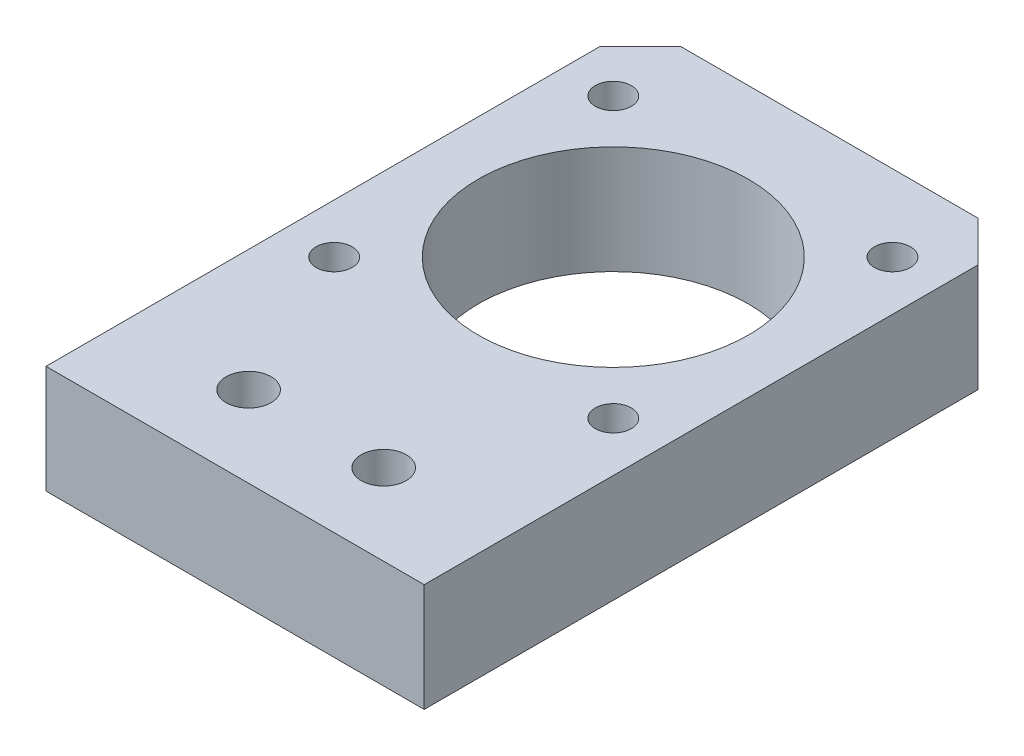
ISO-10303-21;
HEADER;
FILE_DESCRIPTION(('STEP AP214'),'2;1');
FILE_NAME('part.step','',(''),(''),'','','');
FILE_SCHEMA(('AUTOMOTIVE_DESIGN { 1 0 10303 214 1 1 1 1 }'));
ENDSEC;
DATA;
#1=APPLICATION_CONTEXT('core data for automotive mechanical design processes');
#2=APPLICATION_PROTOCOL_DEFINITION('international standard','automotive_design',2000,#1);
#3=PRODUCT_CONTEXT('',#1,'mechanical');
#4=PRODUCT('Part','Part','',(#3));
#5=PRODUCT_RELATED_PRODUCT_CATEGORY('part','',(#4));
#6=PRODUCT_DEFINITION_FORMATION('','',#4);
#7=PRODUCT_DEFINITION_CONTEXT('part definition',#1,'design');
#8=PRODUCT_DEFINITION('design','',#6,#7);
#9=PRODUCT_DEFINITION_SHAPE('','',#8);
#10=(LENGTH_UNIT() NAMED_UNIT(*) SI_UNIT(.MILLI.,.METRE.));
#11=(NAMED_UNIT(*) PLANE_ANGLE_UNIT() SI_UNIT($,.RADIAN.));
#12=(NAMED_UNIT(*) SI_UNIT($,.STERADIAN.) SOLID_ANGLE_UNIT());
#13=UNCERTAINTY_MEASURE_WITH_UNIT(LENGTH_MEASURE(1.E-05),#10,'distance_accuracy_value','');
#14=(GEOMETRIC_REPRESENTATION_CONTEXT(3) GLOBAL_UNCERTAINTY_ASSIGNED_CONTEXT((#13)) GLOBAL_UNIT_ASSIGNED_CONTEXT((#10,
#11,#12)) REPRESENTATION_CONTEXT('',''));
#15=CARTESIAN_POINT('',(0.,0.,0.));
#16=DIRECTION('',(0.,0.,1.));
#17=DIRECTION('',(1.,0.,0.));
#18=AXIS2_PLACEMENT_3D('',#15,#16,#17);
#19=CARTESIAN_POINT('',(-85.9777324242625,12.,-19.4021185238704));
#20=DIRECTION('',(0.,0.,-1.));
#21=DIRECTION('',(-1.,0.,0.));
#22=AXIS2_PLACEMENT_3D('',#19,#20,#21);
#23=PLANE('',#22);
#24=DIRECTION('',(1.,0.,0.));
#25=VECTOR('',#24,1.);
#26=CARTESIAN_POINT('',(-85.9777324242625,0.,-19.4021185238704));
#27=LINE('',#26,#25);
#28=CARTESIAN_POINT('',(-16.9777324242625,0.,-19.4021185238704));
#29=VERTEX_POINT('',#28);
#30=CARTESIAN_POINT('',(25.0222675757375,0.,-19.4021185238704));
#31=VERTEX_POINT('',#30);
#32=EDGE_CURVE('E104',#29,#31,#27,.T.);
#33=ORIENTED_EDGE('',*,*,#32,.T.);
#34=DIRECTION('',(0.,-1.,0.));
#35=VECTOR('',#34,1.);
#36=CARTESIAN_POINT('',(25.0222675757375,12.,-19.4021185238704));
#37=LINE('',#36,#35);
#38=CARTESIAN_POINT('',(25.0222675757375,12.,-19.4021185238704));
#39=VERTEX_POINT('',#38);
#40=EDGE_CURVE('E90',#39,#31,#37,.T.);
#41=ORIENTED_EDGE('',*,*,#40,.F.);
#42=DIRECTION('',(1.,0.,0.));
#43=VECTOR('',#42,1.);
#44=CARTESIAN_POINT('',(-85.9777324242625,12.,-19.4021185238704));
#45=LINE('',#44,#43);
#46=CARTESIAN_POINT('',(-16.9777324242625,12.,-19.4021185238704));
#47=VERTEX_POINT('',#46);
#48=EDGE_CURVE('E102',#47,#39,#45,.T.);
#49=ORIENTED_EDGE('',*,*,#48,.F.);
#50=DIRECTION('',(0.,-1.,0.));
#51=VECTOR('',#50,1.);
#52=CARTESIAN_POINT('',(-16.9777324242625,12.,-19.4021185238704));
#53=LINE('',#52,#51);
#54=EDGE_CURVE('E105',#47,#29,#53,.T.);
#55=ORIENTED_EDGE('',*,*,#54,.T.);
#56=EDGE_LOOP('',(#33,#41,#49,#55));
#57=FACE_BOUND('',#56,.T.);
#58=ADVANCED_FACE('F34',(#57),#23,.F.);
#59=CARTESIAN_POINT('',(0.,12.,0.));
#60=DIRECTION('',(0.,-1.,0.));
#61=DIRECTION('',(0.,0.,-1.));
#62=AXIS2_PLACEMENT_3D('',#59,#60,#61);
#63=PLANE('',#62);
#64=CARTESIAN_POINT('',(-11.4777324242625,12.,-76.9021185238704));
#65=DIRECTION('',(0.,-1.,0.));
#66=DIRECTION('',(0.,0.,-1.));
#67=AXIS2_PLACEMENT_3D('',#64,#65,#66);
#68=CIRCLE('',#67,2.);
#69=CARTESIAN_POINT('',(-11.4777324242625,12.,-78.9021185238704));
#70=VERTEX_POINT('',#69);
#71=EDGE_CURVE('E336',#70,#70,#68,.T.);
#72=ORIENTED_EDGE('',*,*,#71,.T.);
#73=EDGE_LOOP('',(#72));
#74=FACE_BOUND('',#73,.T.);
#75=CARTESIAN_POINT('',(-11.4777324242625,12.,-45.9021185238704));
#76=DIRECTION('',(0.,-1.,0.));
#77=DIRECTION('',(0.,0.,-1.));
#78=AXIS2_PLACEMENT_3D('',#75,#76,#77);
#79=CIRCLE('',#78,2.);
#80=CARTESIAN_POINT('',(-11.4777324242625,12.,-47.9021185238704));
#81=VERTEX_POINT('',#80);
#82=EDGE_CURVE('E357',#81,#81,#79,.T.);
#83=ORIENTED_EDGE('',*,*,#82,.T.);
#84=EDGE_LOOP('',(#83));
#85=FACE_BOUND('',#84,.T.);
#86=CARTESIAN_POINT('',(19.5222675757375,12.,-45.9021185238704));
#87=DIRECTION('',(0.,-1.,0.));
#88=DIRECTION('',(0.,0.,-1.));
#89=AXIS2_PLACEMENT_3D('',#86,#87,#88);
#90=CIRCLE('',#89,2.00000000000001);
#91=CARTESIAN_POINT('',(19.5222675757375,12.,-47.9021185238704));
#92=VERTEX_POINT('',#91);
#93=EDGE_CURVE('E351',#92,#92,#90,.T.);
#94=ORIENTED_EDGE('',*,*,#93,.T.);
#95=EDGE_LOOP('',(#94));
#96=FACE_BOUND('',#95,.T.);
#97=CARTESIAN_POINT('',(19.5222675757375,12.,-76.9021185238704));
#98=DIRECTION('',(0.,-1.,0.));
#99=DIRECTION('',(0.,0.,-1.));
#100=AXIS2_PLACEMENT_3D('',#97,#98,#99);
#101=CIRCLE('',#100,2.00000000000001);
#102=CARTESIAN_POINT('',(19.5222675757375,12.,-78.9021185238704));
#103=VERTEX_POINT('',#102);
#104=EDGE_CURVE('E345',#103,#103,#101,.T.);
#105=ORIENTED_EDGE('',*,*,#104,.T.);
#106=EDGE_LOOP('',(#105));
#107=FACE_BOUND('',#106,.T.);
#108=CARTESIAN_POINT('',(4.02226757573749,12.,-61.4021185238704));
#109=DIRECTION('',(0.,-1.,0.));
#110=DIRECTION('',(0.,0.,-1.));
#111=AXIS2_PLACEMENT_3D('',#108,#109,#110);
#112=CIRCLE('',#111,15.);
#113=CARTESIAN_POINT('',(4.02226757573749,12.,-76.4021185238704));
#114=VERTEX_POINT('',#113);
#115=EDGE_CURVE('E140',#114,#114,#112,.T.);
#116=ORIENTED_EDGE('',*,*,#115,.T.);
#117=EDGE_LOOP('',(#116));
#118=FACE_BOUND('',#117,.T.);
#119=CARTESIAN_POINT('',(-3.47773242426255,12.,-28.4021185238704));
#120=DIRECTION('',(0.,1.,0.));
#121=DIRECTION('',(0.,0.,1.));
#122=AXIS2_PLACEMENT_3D('',#119,#120,#121);
#123=CIRCLE('',#122,2.5);
#124=CARTESIAN_POINT('',(-3.47773242426255,12.,-25.9021185238704));
#125=VERTEX_POINT('',#124);
#126=EDGE_CURVE('E152',#125,#125,#123,.T.);
#127=ORIENTED_EDGE('',*,*,#126,.F.);
#128=EDGE_LOOP('',(#127));
#129=FACE_BOUND('',#128,.T.);
#130=CARTESIAN_POINT('',(11.5222675757375,12.,-28.4021185238704));
#131=DIRECTION('',(0.,1.,0.));
#132=DIRECTION('',(0.,0.,1.));
#133=AXIS2_PLACEMENT_3D('',#130,#131,#132);
#134=CIRCLE('',#133,2.5);
#135=CARTESIAN_POINT('',(11.5222675757375,12.,-25.9021185238704));
#136=VERTEX_POINT('',#135);
#137=EDGE_CURVE('E117',#136,#136,#134,.T.);
#138=ORIENTED_EDGE('',*,*,#137,.F.);
#139=EDGE_LOOP('',(#138));
#140=FACE_BOUND('',#139,.T.);
#141=ORIENTED_EDGE('',*,*,#48,.T.);
#142=DIRECTION('',(0.,0.,1.));
#143=VECTOR('',#142,1.);
#144=CARTESIAN_POINT('',(25.0222675757375,12.,-85.4021185238704));
#145=LINE('',#144,#143);
#146=CARTESIAN_POINT('',(25.0222675757375,12.,-80.9021185238704));
#147=VERTEX_POINT('',#146);
#148=EDGE_CURVE('E87',#147,#39,#145,.T.);
#149=ORIENTED_EDGE('',*,*,#148,.F.);
#150=DIRECTION('',(0.707106781186545,0.,0.70710678118655));
#151=VECTOR('',#150,1.);
#152=CARTESIAN_POINT('',(20.5222675757375,12.,-85.4021185238704));
#153=LINE('',#152,#151);
#154=CARTESIAN_POINT('',(20.5222675757375,12.,-85.4021185238704));
#155=VERTEX_POINT('',#154);
#156=EDGE_CURVE('E122',#147,#155,#153,.F.);
#157=ORIENTED_EDGE('',*,*,#156,.T.);
#158=DIRECTION('',(1.,0.,0.));
#159=VECTOR('',#158,1.);
#160=CARTESIAN_POINT('',(25.0222675757375,12.,-85.4021185238704));
#161=LINE('',#160,#159);
#162=CARTESIAN_POINT('',(-12.4777324242625,12.,-85.4021185238704));
#163=VERTEX_POINT('',#162);
#164=EDGE_CURVE('E97',#163,#155,#161,.T.);
#165=ORIENTED_EDGE('',*,*,#164,.F.);
#166=DIRECTION('',(0.707106781186545,0.,-0.70710678118655));
#167=VECTOR('',#166,1.);
#168=CARTESIAN_POINT('',(-12.4777324242625,12.,-85.4021185238704));
#169=LINE('',#168,#167);
#170=CARTESIAN_POINT('',(-16.9777324242625,12.,-80.9021185238704));
#171=VERTEX_POINT('',#170);
#172=EDGE_CURVE('E124',#163,#171,#169,.F.);
#173=ORIENTED_EDGE('',*,*,#172,.T.);
#174=DIRECTION('',(0.,0.,1.));
#175=VECTOR('',#174,1.);
#176=CARTESIAN_POINT('',(-16.9777324242625,12.,-85.4021185238704));
#177=LINE('',#176,#175);
#178=EDGE_CURVE('E96',#171,#47,#177,.T.);
#179=ORIENTED_EDGE('',*,*,#178,.T.);
#180=EDGE_LOOP('',(#141,#149,#157,#165,#173,#179));
#181=FACE_BOUND('',#180,.T.);
#182=ADVANCED_FACE('F107',(#74,#85,#96,#107,#118,#129,#140,#181),#63,.F.);
#183=CARTESIAN_POINT('',(0.,0.,0.));
#184=DIRECTION('',(0.,-1.,0.));
#185=DIRECTION('',(0.,0.,-1.));
#186=AXIS2_PLACEMENT_3D('',#183,#184,#185);
#187=PLANE('',#186);
#188=DIRECTION('',(0.,0.,1.));
#189=VECTOR('',#188,1.);
#190=CARTESIAN_POINT('',(25.0222675757375,0.,-85.4021185238704));
#191=LINE('',#190,#189);
#192=CARTESIAN_POINT('',(25.0222675757375,0.,-80.9021185238704));
#193=VERTEX_POINT('',#192);
#194=EDGE_CURVE('E145',#193,#31,#191,.T.);
#195=ORIENTED_EDGE('',*,*,#194,.T.);
#196=ORIENTED_EDGE('',*,*,#32,.F.);
#197=DIRECTION('',(0.,0.,1.));
#198=VECTOR('',#197,1.);
#199=CARTESIAN_POINT('',(-16.9777324242625,0.,-85.4021185238704));
#200=LINE('',#199,#198);
#201=CARTESIAN_POINT('',(-16.9777324242625,0.,-80.9021185238704));
#202=VERTEX_POINT('',#201);
#203=EDGE_CURVE('E132',#202,#29,#200,.T.);
#204=ORIENTED_EDGE('',*,*,#203,.F.);
#205=DIRECTION('',(-0.707106781186545,0.,0.70710678118655));
#206=VECTOR('',#205,1.);
#207=CARTESIAN_POINT('',(-48.9399254740665,0.,-48.9399254740662));
#208=LINE('',#207,#206);
#209=CARTESIAN_POINT('',(-12.4777324242625,0.,-85.4021185238704));
#210=VERTEX_POINT('',#209);
#211=EDGE_CURVE('E42',#202,#210,#208,.F.);
#212=ORIENTED_EDGE('',*,*,#211,.T.);
#213=DIRECTION('',(-1.,0.,0.));
#214=VECTOR('',#213,1.);
#215=CARTESIAN_POINT('',(25.0222675757375,0.,-85.4021185238704));
#216=LINE('',#215,#214);
#217=CARTESIAN_POINT('',(20.5222675757375,0.,-85.4021185238704));
#218=VERTEX_POINT('',#217);
#219=EDGE_CURVE('E131',#218,#210,#216,.T.);
#220=ORIENTED_EDGE('',*,*,#219,.F.);
#221=DIRECTION('',(-0.707106781186545,0.,-0.70710678118655));
#222=VECTOR('',#221,1.);
#223=CARTESIAN_POINT('',(52.962193049804,0.,-52.9621930498036));
#224=LINE('',#223,#222);
#225=EDGE_CURVE('E49',#218,#193,#224,.F.);
#226=ORIENTED_EDGE('',*,*,#225,.T.);
#227=EDGE_LOOP('',(#195,#196,#204,#212,#220,#226));
#228=FACE_BOUND('',#227,.T.);
#229=CARTESIAN_POINT('',(-11.4777324242625,0.,-76.9021185238704));
#230=DIRECTION('',(0.,-1.,0.));
#231=DIRECTION('',(0.,0.,-1.));
#232=AXIS2_PLACEMENT_3D('',#229,#230,#231);
#233=CIRCLE('',#232,2.);
#234=CARTESIAN_POINT('',(-11.4777324242625,0.,-78.9021185238704));
#235=VERTEX_POINT('',#234);
#236=EDGE_CURVE('E339',#235,#235,#233,.T.);
#237=ORIENTED_EDGE('',*,*,#236,.F.);
#238=EDGE_LOOP('',(#237));
#239=FACE_BOUND('',#238,.T.);
#240=CARTESIAN_POINT('',(-11.4777324242625,0.,-45.9021185238704));
#241=DIRECTION('',(0.,-1.,0.));
#242=DIRECTION('',(0.,0.,-1.));
#243=AXIS2_PLACEMENT_3D('',#240,#241,#242);
#244=CIRCLE('',#243,2.);
#245=CARTESIAN_POINT('',(-11.4777324242625,0.,-47.9021185238704));
#246=VERTEX_POINT('',#245);
#247=EDGE_CURVE('E354',#246,#246,#244,.T.);
#248=ORIENTED_EDGE('',*,*,#247,.F.);
#249=EDGE_LOOP('',(#248));
#250=FACE_BOUND('',#249,.T.);
#251=CARTESIAN_POINT('',(19.5222675757375,0.,-45.9021185238704));
#252=DIRECTION('',(0.,-1.,0.));
#253=DIRECTION('',(0.,0.,-1.));
#254=AXIS2_PLACEMENT_3D('',#251,#252,#253);
#255=CIRCLE('',#254,2.00000000000001);
#256=CARTESIAN_POINT('',(19.5222675757375,0.,-47.9021185238704));
#257=VERTEX_POINT('',#256);
#258=EDGE_CURVE('E348',#257,#257,#255,.T.);
#259=ORIENTED_EDGE('',*,*,#258,.F.);
#260=EDGE_LOOP('',(#259));
#261=FACE_BOUND('',#260,.T.);
#262=CARTESIAN_POINT('',(19.5222675757375,0.,-76.9021185238704));
#263=DIRECTION('',(0.,-1.,0.));
#264=DIRECTION('',(0.,0.,-1.));
#265=AXIS2_PLACEMENT_3D('',#262,#263,#264);
#266=CIRCLE('',#265,2.00000000000001);
#267=CARTESIAN_POINT('',(19.5222675757375,0.,-78.9021185238704));
#268=VERTEX_POINT('',#267);
#269=EDGE_CURVE('E342',#268,#268,#266,.T.);
#270=ORIENTED_EDGE('',*,*,#269,.F.);
#271=EDGE_LOOP('',(#270));
#272=FACE_BOUND('',#271,.T.);
#273=CARTESIAN_POINT('',(4.02226757573749,0.,-61.4021185238704));
#274=DIRECTION('',(0.,-1.,0.));
#275=DIRECTION('',(0.,0.,-1.));
#276=AXIS2_PLACEMENT_3D('',#273,#274,#275);
#277=CIRCLE('',#276,15.);
#278=CARTESIAN_POINT('',(4.02226757573749,0.,-76.4021185238704));
#279=VERTEX_POINT('',#278);
#280=EDGE_CURVE('E334',#279,#279,#277,.T.);
#281=ORIENTED_EDGE('',*,*,#280,.F.);
#282=EDGE_LOOP('',(#281));
#283=FACE_BOUND('',#282,.T.);
#284=CARTESIAN_POINT('',(-3.47773242426255,0.,-28.4021185238704));
#285=DIRECTION('',(0.,1.,0.));
#286=DIRECTION('',(0.,0.,1.));
#287=AXIS2_PLACEMENT_3D('',#284,#285,#286);
#288=CIRCLE('',#287,2.5);
#289=CARTESIAN_POINT('',(-3.47773242426255,0.,-25.9021185238704));
#290=VERTEX_POINT('',#289);
#291=EDGE_CURVE('E114',#290,#290,#288,.T.);
#292=ORIENTED_EDGE('',*,*,#291,.T.);
#293=EDGE_LOOP('',(#292));
#294=FACE_BOUND('',#293,.T.);
#295=CARTESIAN_POINT('',(11.5222675757375,0.,-28.4021185238704));
#296=DIRECTION('',(0.,1.,0.));
#297=DIRECTION('',(0.,0.,1.));
#298=AXIS2_PLACEMENT_3D('',#295,#296,#297);
#299=CIRCLE('',#298,2.5);
#300=CARTESIAN_POINT('',(11.5222675757375,0.,-25.9021185238704));
#301=VERTEX_POINT('',#300);
#302=EDGE_CURVE('E154',#301,#301,#299,.T.);
#303=ORIENTED_EDGE('',*,*,#302,.T.);
#304=EDGE_LOOP('',(#303));
#305=FACE_BOUND('',#304,.T.);
#306=ADVANCED_FACE('F129',(#228,#239,#250,#261,#272,#283,#294,#305),#187,.T.);
#307=CARTESIAN_POINT('',(11.5222675757375,0.,-28.4021185238704));
#308=DIRECTION('',(0.,1.,0.));
#309=DIRECTION('',(0.,0.,1.));
#310=AXIS2_PLACEMENT_3D('',#307,#308,#309);
#311=CYLINDRICAL_SURFACE('',#310,2.5);
#312=ORIENTED_EDGE('',*,*,#302,.F.);
#313=EDGE_LOOP('',(#312));
#314=FACE_BOUND('',#313,.T.);
#315=ORIENTED_EDGE('',*,*,#137,.T.);
#316=EDGE_LOOP('',(#315));
#317=FACE_BOUND('',#316,.T.);
#318=ADVANCED_FACE('F161',(#314,#317),#311,.F.);
#319=CARTESIAN_POINT('',(-3.47773242426255,0.,-28.4021185238704));
#320=DIRECTION('',(0.,1.,0.));
#321=DIRECTION('',(0.,0.,1.));
#322=AXIS2_PLACEMENT_3D('',#319,#320,#321);
#323=CYLINDRICAL_SURFACE('',#322,2.5);
#324=ORIENTED_EDGE('',*,*,#291,.F.);
#325=EDGE_LOOP('',(#324));
#326=FACE_BOUND('',#325,.T.);
#327=ORIENTED_EDGE('',*,*,#126,.T.);
#328=EDGE_LOOP('',(#327));
#329=FACE_BOUND('',#328,.T.);
#330=ADVANCED_FACE('F211',(#326,#329),#323,.F.);
#331=CARTESIAN_POINT('',(25.0222675757375,0.,-85.4021185238704));
#332=DIRECTION('',(-1.,0.,0.));
#333=DIRECTION('',(0.,-1.,0.));
#334=AXIS2_PLACEMENT_3D('',#331,#332,#333);
#335=PLANE('',#334);
#336=ORIENTED_EDGE('',*,*,#148,.T.);
#337=ORIENTED_EDGE('',*,*,#40,.T.);
#338=ORIENTED_EDGE('',*,*,#194,.F.);
#339=DIRECTION('',(0.,1.,0.));
#340=VECTOR('',#339,1.);
#341=CARTESIAN_POINT('',(25.0222675757375,0.,-80.9021185238704));
#342=LINE('',#341,#340);
#343=EDGE_CURVE('E11',#193,#147,#342,.T.);
#344=ORIENTED_EDGE('',*,*,#343,.T.);
#345=EDGE_LOOP('',(#336,#337,#338,#344));
#346=FACE_BOUND('',#345,.T.);
#347=ADVANCED_FACE('F89',(#346),#335,.F.);
#348=CARTESIAN_POINT('',(-16.9777324242625,0.,-85.4021185238704));
#349=DIRECTION('',(1.,0.,0.));
#350=DIRECTION('',(0.,1.,0.));
#351=AXIS2_PLACEMENT_3D('',#348,#349,#350);
#352=PLANE('',#351);
#353=ORIENTED_EDGE('',*,*,#203,.T.);
#354=ORIENTED_EDGE('',*,*,#54,.F.);
#355=ORIENTED_EDGE('',*,*,#178,.F.);
#356=DIRECTION('',(0.,-1.,0.));
#357=VECTOR('',#356,1.);
#358=CARTESIAN_POINT('',(-16.9777324242625,0.,-80.9021185238704));
#359=LINE('',#358,#357);
#360=EDGE_CURVE('E57',#171,#202,#359,.T.);
#361=ORIENTED_EDGE('',*,*,#360,.T.);
#362=EDGE_LOOP('',(#353,#354,#355,#361));
#363=FACE_BOUND('',#362,.T.);
#364=ADVANCED_FACE('F143',(#363),#352,.F.);
#365=CARTESIAN_POINT('',(0.,0.,-85.4021185238704));
#366=DIRECTION('',(0.,0.,1.));
#367=DIRECTION('',(1.,0.,0.));
#368=AXIS2_PLACEMENT_3D('',#365,#366,#367);
#369=PLANE('',#368);
#370=ORIENTED_EDGE('',*,*,#219,.T.);
#371=DIRECTION('',(0.,1.,0.));
#372=VECTOR('',#371,1.);
#373=CARTESIAN_POINT('',(-12.4777324242625,0.,-85.4021185238704));
#374=LINE('',#373,#372);
#375=EDGE_CURVE('E112',#210,#163,#374,.T.);
#376=ORIENTED_EDGE('',*,*,#375,.T.);
#377=ORIENTED_EDGE('',*,*,#164,.T.);
#378=DIRECTION('',(0.,-1.,0.));
#379=VECTOR('',#378,1.);
#380=CARTESIAN_POINT('',(20.5222675757375,0.,-85.4021185238704));
#381=LINE('',#380,#379);
#382=EDGE_CURVE('E109',#155,#218,#381,.T.);
#383=ORIENTED_EDGE('',*,*,#382,.T.);
#384=EDGE_LOOP('',(#370,#376,#377,#383));
#385=FACE_BOUND('',#384,.T.);
#386=ADVANCED_FACE('F136',(#385),#369,.F.);
#387=CARTESIAN_POINT('',(4.02226757573749,12.,-61.4021185238704));
#388=DIRECTION('',(0.,-1.,0.));
#389=DIRECTION('',(0.,0.,-1.));
#390=AXIS2_PLACEMENT_3D('',#387,#388,#389);
#391=CYLINDRICAL_SURFACE('',#390,15.);
#392=ORIENTED_EDGE('',*,*,#115,.F.);
#393=EDGE_LOOP('',(#392));
#394=FACE_BOUND('',#393,.T.);
#395=ORIENTED_EDGE('',*,*,#280,.T.);
#396=EDGE_LOOP('',(#395));
#397=FACE_BOUND('',#396,.T.);
#398=ADVANCED_FACE('F201',(#394,#397),#391,.F.);
#399=CARTESIAN_POINT('',(19.5222675757375,12.,-76.9021185238704));
#400=DIRECTION('',(0.,-1.,0.));
#401=DIRECTION('',(0.,0.,-1.));
#402=AXIS2_PLACEMENT_3D('',#399,#400,#401);
#403=CYLINDRICAL_SURFACE('',#402,2.00000000000001);
#404=ORIENTED_EDGE('',*,*,#104,.F.);
#405=EDGE_LOOP('',(#404));
#406=FACE_BOUND('',#405,.T.);
#407=ORIENTED_EDGE('',*,*,#269,.T.);
#408=EDGE_LOOP('',(#407));
#409=FACE_BOUND('',#408,.T.);
#410=ADVANCED_FACE('F197',(#406,#409),#403,.F.);
#411=CARTESIAN_POINT('',(19.5222675757375,12.,-45.9021185238704));
#412=DIRECTION('',(0.,-1.,0.));
#413=DIRECTION('',(0.,0.,-1.));
#414=AXIS2_PLACEMENT_3D('',#411,#412,#413);
#415=CYLINDRICAL_SURFACE('',#414,2.00000000000001);
#416=ORIENTED_EDGE('',*,*,#93,.F.);
#417=EDGE_LOOP('',(#416));
#418=FACE_BOUND('',#417,.T.);
#419=ORIENTED_EDGE('',*,*,#258,.T.);
#420=EDGE_LOOP('',(#419));
#421=FACE_BOUND('',#420,.T.);
#422=ADVANCED_FACE('F189',(#418,#421),#415,.F.);
#423=CARTESIAN_POINT('',(-11.4777324242625,12.,-45.9021185238704));
#424=DIRECTION('',(0.,-1.,0.));
#425=DIRECTION('',(0.,0.,-1.));
#426=AXIS2_PLACEMENT_3D('',#423,#424,#425);
#427=CYLINDRICAL_SURFACE('',#426,2.);
#428=ORIENTED_EDGE('',*,*,#82,.F.);
#429=EDGE_LOOP('',(#428));
#430=FACE_BOUND('',#429,.T.);
#431=ORIENTED_EDGE('',*,*,#247,.T.);
#432=EDGE_LOOP('',(#431));
#433=FACE_BOUND('',#432,.T.);
#434=ADVANCED_FACE('F183',(#430,#433),#427,.F.);
#435=CARTESIAN_POINT('',(-11.4777324242625,12.,-76.9021185238704));
#436=DIRECTION('',(0.,-1.,0.));
#437=DIRECTION('',(0.,0.,-1.));
#438=AXIS2_PLACEMENT_3D('',#435,#436,#437);
#439=CYLINDRICAL_SURFACE('',#438,2.);
#440=ORIENTED_EDGE('',*,*,#71,.F.);
#441=EDGE_LOOP('',(#440));
#442=FACE_BOUND('',#441,.T.);
#443=ORIENTED_EDGE('',*,*,#236,.T.);
#444=EDGE_LOOP('',(#443));
#445=FACE_BOUND('',#444,.T.);
#446=ADVANCED_FACE('F177',(#442,#445),#439,.F.);
#447=CARTESIAN_POINT('',(-12.4777324242625,0.,-85.4021185238704));
#448=DIRECTION('',(0.70710678118655,0.,0.707106781186545));
#449=DIRECTION('',(0.,1.,0.));
#450=AXIS2_PLACEMENT_3D('',#447,#448,#449);
#451=PLANE('',#450);
#452=ORIENTED_EDGE('',*,*,#211,.F.);
#453=ORIENTED_EDGE('',*,*,#360,.F.);
#454=ORIENTED_EDGE('',*,*,#172,.F.);
#455=ORIENTED_EDGE('',*,*,#375,.F.);
#456=EDGE_LOOP('',(#452,#453,#454,#455));
#457=FACE_BOUND('',#456,.T.);
#458=ADVANCED_FACE('F142',(#457),#451,.F.);
#459=CARTESIAN_POINT('',(20.5222675757375,0.,-85.4021185238704));
#460=DIRECTION('',(-0.70710678118655,0.,0.707106781186545));
#461=DIRECTION('',(0.,-1.,0.));
#462=AXIS2_PLACEMENT_3D('',#459,#460,#461);
#463=PLANE('',#462);
#464=ORIENTED_EDGE('',*,*,#156,.F.);
#465=ORIENTED_EDGE('',*,*,#343,.F.);
#466=ORIENTED_EDGE('',*,*,#225,.F.);
#467=ORIENTED_EDGE('',*,*,#382,.F.);
#468=EDGE_LOOP('',(#464,#465,#466,#467));
#469=FACE_BOUND('',#468,.T.);
#470=ADVANCED_FACE('F36',(#469),#463,.F.);
#471=CLOSED_SHELL('',(#58,#182,#306,#318,#330,#347,#364,#386,#398,#410,#422,#434,#446,#458,#470));
#472=MANIFOLD_SOLID_BREP('B2',#471);
#473=ADVANCED_BREP_SHAPE_REPRESENTATION('',(#18,#472),#14);
#474=SHAPE_DEFINITION_REPRESENTATION(#9,#473);
ENDSEC;
END-ISO-10303-21;
